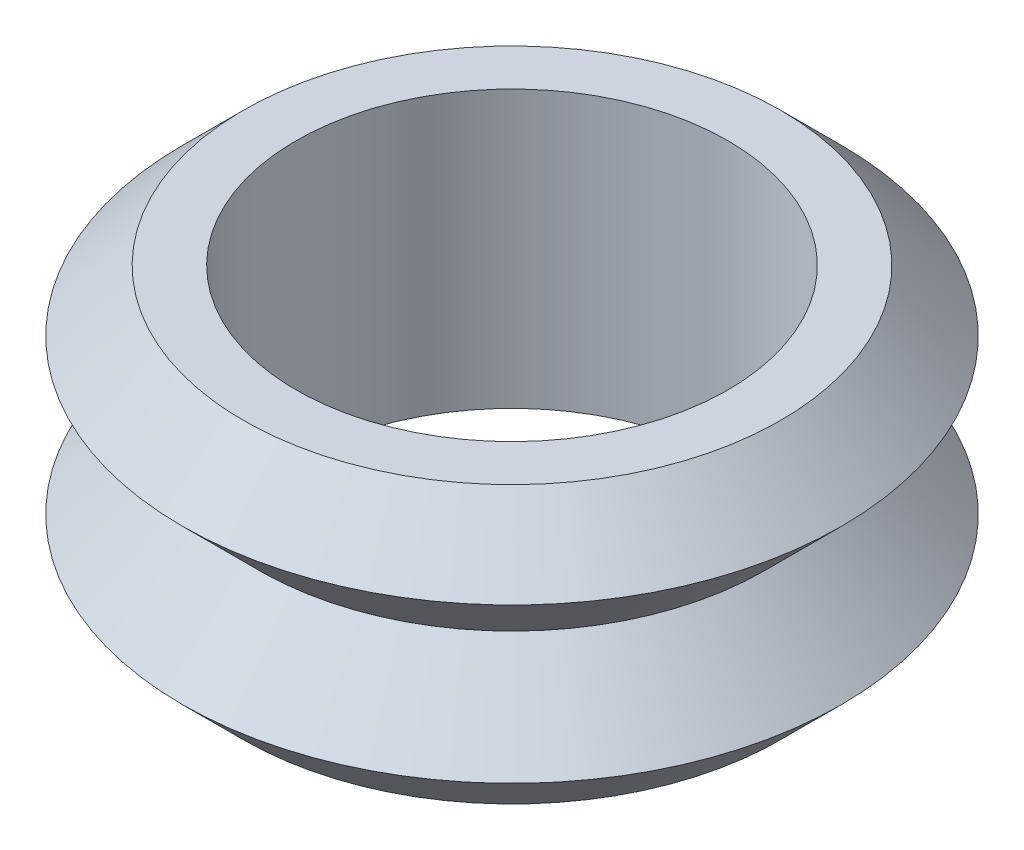
ISO-10303-21;
HEADER;
FILE_DESCRIPTION(('STEP AP214'),'2;1');
FILE_NAME('part.step','',(''),(''),'','','');
FILE_SCHEMA(('AUTOMOTIVE_DESIGN { 1 0 10303 214 1 1 1 1 }'));
ENDSEC;
DATA;
#1=APPLICATION_CONTEXT('core data for automotive mechanical design processes');
#2=APPLICATION_PROTOCOL_DEFINITION('international standard','automotive_design',2000,#1);
#3=PRODUCT_CONTEXT('',#1,'mechanical');
#4=PRODUCT('Part','Part','',(#3));
#5=PRODUCT_RELATED_PRODUCT_CATEGORY('part','',(#4));
#6=PRODUCT_DEFINITION_FORMATION('','',#4);
#7=PRODUCT_DEFINITION_CONTEXT('part definition',#1,'design');
#8=PRODUCT_DEFINITION('design','',#6,#7);
#9=PRODUCT_DEFINITION_SHAPE('','',#8);
#10=(LENGTH_UNIT() NAMED_UNIT(*) SI_UNIT(.MILLI.,.METRE.));
#11=(NAMED_UNIT(*) PLANE_ANGLE_UNIT() SI_UNIT($,.RADIAN.));
#12=(NAMED_UNIT(*) SI_UNIT($,.STERADIAN.) SOLID_ANGLE_UNIT());
#13=UNCERTAINTY_MEASURE_WITH_UNIT(LENGTH_MEASURE(1.E-05),#10,'distance_accuracy_value','');
#14=(GEOMETRIC_REPRESENTATION_CONTEXT(3) GLOBAL_UNCERTAINTY_ASSIGNED_CONTEXT((#13)) GLOBAL_UNIT_ASSIGNED_CONTEXT((#10,
#11,#12)) REPRESENTATION_CONTEXT('',''));
#15=CARTESIAN_POINT('',(0.,0.,0.));
#16=DIRECTION('',(0.,0.,1.));
#17=DIRECTION('',(1.,0.,0.));
#18=AXIS2_PLACEMENT_3D('',#15,#16,#17);
#19=CARTESIAN_POINT('',(0.,2.25866208919923,0.));
#20=DIRECTION('',(0.,-1.,0.));
#21=DIRECTION('',(0.,0.,-1.));
#22=AXIS2_PLACEMENT_3D('',#19,#20,#21);
#23=CONICAL_SURFACE('',#22,12.1950000000036,0.7853981634);
#24=CARTESIAN_POINT('',(0.,2.25866208919271,0.));
#25=DIRECTION('',(0.,1.,0.));
#26=DIRECTION('',(1.,0.,0.));
#27=AXIS2_PLACEMENT_3D('',#24,#25,#26);
#28=CIRCLE('',#27,12.1950000000029);
#29=CARTESIAN_POINT('',(12.1950000000029,2.25866208919271,0.));
#30=VERTEX_POINT('',#29);
#31=EDGE_CURVE('E40',#30,#30,#28,.F.);
#32=ORIENTED_EDGE('',*,*,#31,.F.);
#33=EDGE_LOOP('',(#32));
#34=FACE_BOUND('',#33,.T.);
#35=CARTESIAN_POINT('',(0.,5.11500000000364,0.));
#36=DIRECTION('',(0.,1.,0.));
#37=DIRECTION('',(1.,0.,0.));
#38=AXIS2_PLACEMENT_3D('',#35,#36,#37);
#39=CIRCLE('',#38,9.33866208919194);
#40=CARTESIAN_POINT('',(9.33866208919194,5.11500000000364,0.));
#41=VERTEX_POINT('',#40);
#42=EDGE_CURVE('E45',#41,#41,#39,.T.);
#43=ORIENTED_EDGE('',*,*,#42,.F.);
#44=EDGE_LOOP('',(#43));
#45=FACE_BOUND('',#44,.T.);
#46=ADVANCED_FACE('F15',(#34,#45),#23,.T.);
#47=CARTESIAN_POINT('',(0.,7.97133791080077,0.));
#48=DIRECTION('',(0.,1.,0.));
#49=DIRECTION('',(0.,0.,1.));
#50=AXIS2_PLACEMENT_3D('',#47,#48,#49);
#51=CONICAL_SURFACE('',#50,12.1950000000036,0.7853981634);
#52=ORIENTED_EDGE('',*,*,#42,.T.);
#53=EDGE_LOOP('',(#52));
#54=FACE_BOUND('',#53,.T.);
#55=CARTESIAN_POINT('',(0.,7.9713379108073,0.));
#56=DIRECTION('',(0.,-1.,0.));
#57=DIRECTION('',(1.,0.,0.));
#58=AXIS2_PLACEMENT_3D('',#55,#56,#57);
#59=CIRCLE('',#58,12.1950000000029);
#60=CARTESIAN_POINT('',(12.1950000000029,7.9713379108073,0.));
#61=VERTEX_POINT('',#60);
#62=EDGE_CURVE('E36',#61,#61,#59,.F.);
#63=ORIENTED_EDGE('',*,*,#62,.F.);
#64=EDGE_LOOP('',(#63));
#65=FACE_BOUND('',#64,.T.);
#66=ADVANCED_FACE('F54',(#54,#65),#51,.T.);
#67=CARTESIAN_POINT('',(0.,2.25866208919271,0.));
#68=DIRECTION('',(0.,1.,0.));
#69=DIRECTION('',(0.,0.,1.));
#70=AXIS2_PLACEMENT_3D('',#67,#68,#69);
#71=CONICAL_SURFACE('',#70,12.1950000000029,0.7853981634);
#72=CARTESIAN_POINT('',(0.,2.88094201272848E-12,0.));
#73=DIRECTION('',(0.,1.,0.));
#74=DIRECTION('',(0.,0.,1.));
#75=AXIS2_PLACEMENT_3D('',#72,#73,#74);
#76=CIRCLE('',#75,9.93633791080153);
#77=CARTESIAN_POINT('',(0.,2.88094201272848E-12,9.93633791080153));
#78=VERTEX_POINT('',#77);
#79=EDGE_CURVE('E18',#78,#78,#76,.F.);
#80=ORIENTED_EDGE('',*,*,#79,.F.);
#81=EDGE_LOOP('',(#80));
#82=FACE_BOUND('',#81,.T.);
#83=ORIENTED_EDGE('',*,*,#31,.T.);
#84=EDGE_LOOP('',(#83));
#85=FACE_BOUND('',#84,.T.);
#86=ADVANCED_FACE('F62',(#82,#85),#71,.T.);
#87=CARTESIAN_POINT('',(0.,7.9713379108073,0.));
#88=DIRECTION('',(0.,-1.,0.));
#89=DIRECTION('',(0.,0.,-1.));
#90=AXIS2_PLACEMENT_3D('',#87,#88,#89);
#91=CONICAL_SURFACE('',#90,12.1950000000029,0.7853981634);
#92=ORIENTED_EDGE('',*,*,#62,.T.);
#93=EDGE_LOOP('',(#92));
#94=FACE_BOUND('',#93,.T.);
#95=CARTESIAN_POINT('',(0.,10.2299999999971,0.));
#96=DIRECTION('',(0.,-1.,0.));
#97=DIRECTION('',(0.,0.,-1.));
#98=AXIS2_PLACEMENT_3D('',#95,#96,#97);
#99=CIRCLE('',#98,9.93633791080153);
#100=CARTESIAN_POINT('',(0.,10.2299999999971,-9.93633791080153));
#101=VERTEX_POINT('',#100);
#102=EDGE_CURVE('E27',#101,#101,#99,.F.);
#103=ORIENTED_EDGE('',*,*,#102,.F.);
#104=EDGE_LOOP('',(#103));
#105=FACE_BOUND('',#104,.T.);
#106=ADVANCED_FACE('F78',(#94,#105),#91,.T.);
#107=CARTESIAN_POINT('',(7.987,0.,0.));
#108=DIRECTION('',(0.,-1.,0.));
#109=DIRECTION('',(0.,0.,-1.));
#110=AXIS2_PLACEMENT_3D('',#107,#108,#109);
#111=PLANE('',#110);
#112=CARTESIAN_POINT('',(0.,0.,0.));
#113=DIRECTION('',(0.,-1.,0.));
#114=DIRECTION('',(0.,0.,-1.));
#115=AXIS2_PLACEMENT_3D('',#112,#113,#114);
#116=CIRCLE('',#115,7.987);
#117=CARTESIAN_POINT('',(0.,0.,-7.987));
#118=VERTEX_POINT('',#117);
#119=EDGE_CURVE('E22',#118,#118,#116,.F.);
#120=ORIENTED_EDGE('',*,*,#119,.T.);
#121=EDGE_LOOP('',(#120));
#122=FACE_BOUND('',#121,.T.);
#123=ORIENTED_EDGE('',*,*,#79,.T.);
#124=EDGE_LOOP('',(#123));
#125=FACE_BOUND('',#124,.T.);
#126=ADVANCED_FACE('F72',(#122,#125),#111,.T.);
#127=CARTESIAN_POINT('',(9.93633791080441,10.23,0.));
#128=DIRECTION('',(0.,1.,0.));
#129=DIRECTION('',(0.,0.,1.));
#130=AXIS2_PLACEMENT_3D('',#127,#128,#129);
#131=PLANE('',#130);
#132=ORIENTED_EDGE('',*,*,#102,.T.);
#133=EDGE_LOOP('',(#132));
#134=FACE_BOUND('',#133,.T.);
#135=CARTESIAN_POINT('',(0.,10.23,0.));
#136=DIRECTION('',(0.,-1.,0.));
#137=DIRECTION('',(0.,0.,-1.));
#138=AXIS2_PLACEMENT_3D('',#135,#136,#137);
#139=CIRCLE('',#138,7.987);
#140=CARTESIAN_POINT('',(0.,10.23,-7.987));
#141=VERTEX_POINT('',#140);
#142=EDGE_CURVE('E9',#141,#141,#139,.T.);
#143=ORIENTED_EDGE('',*,*,#142,.T.);
#144=EDGE_LOOP('',(#143));
#145=FACE_BOUND('',#144,.T.);
#146=ADVANCED_FACE('F66',(#134,#145),#131,.T.);
#147=CARTESIAN_POINT('',(0.,5.115,0.));
#148=DIRECTION('',(0.,-1.,0.));
#149=DIRECTION('',(0.,0.,-1.));
#150=AXIS2_PLACEMENT_3D('',#147,#148,#149);
#151=CYLINDRICAL_SURFACE('',#150,7.987);
#152=ORIENTED_EDGE('',*,*,#142,.F.);
#153=EDGE_LOOP('',(#152));
#154=FACE_BOUND('',#153,.T.);
#155=ORIENTED_EDGE('',*,*,#119,.F.);
#156=EDGE_LOOP('',(#155));
#157=FACE_BOUND('',#156,.T.);
#158=ADVANCED_FACE('F64',(#154,#157),#151,.F.);
#159=CLOSED_SHELL('',(#46,#66,#86,#106,#126,#146,#158));
#160=MANIFOLD_SOLID_BREP('B1',#159);
#161=ADVANCED_BREP_SHAPE_REPRESENTATION('',(#18,#160),#14);
#162=SHAPE_DEFINITION_REPRESENTATION(#9,#161);
ENDSEC;
END-ISO-10303-21;
